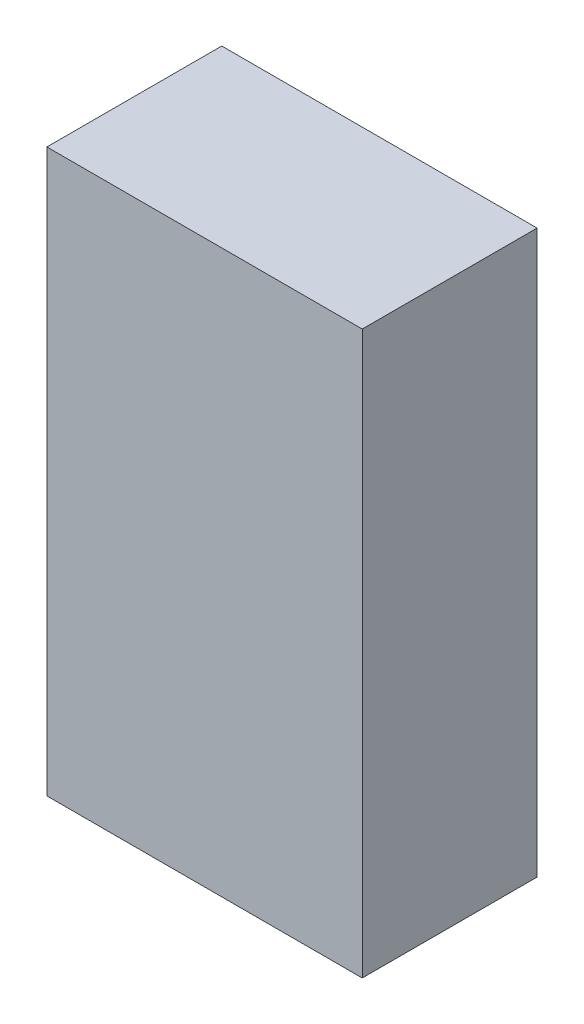
ISO-10303-21;
HEADER;
FILE_DESCRIPTION(('STEP AP214'),'2;1');
FILE_NAME('part.step','',(''),(''),'','','');
FILE_SCHEMA(('AUTOMOTIVE_DESIGN { 1 0 10303 214 1 1 1 1 }'));
ENDSEC;
DATA;
#1=APPLICATION_CONTEXT('core data for automotive mechanical design processes');
#2=APPLICATION_PROTOCOL_DEFINITION('international standard','automotive_design',2000,#1);
#3=PRODUCT_CONTEXT('',#1,'mechanical');
#4=PRODUCT('Part','Part','',(#3));
#5=PRODUCT_RELATED_PRODUCT_CATEGORY('part','',(#4));
#6=PRODUCT_DEFINITION_FORMATION('','',#4);
#7=PRODUCT_DEFINITION_CONTEXT('part definition',#1,'design');
#8=PRODUCT_DEFINITION('design','',#6,#7);
#9=PRODUCT_DEFINITION_SHAPE('','',#8);
#10=(LENGTH_UNIT() NAMED_UNIT(*) SI_UNIT(.MILLI.,.METRE.));
#11=(NAMED_UNIT(*) PLANE_ANGLE_UNIT() SI_UNIT($,.RADIAN.));
#12=(NAMED_UNIT(*) SI_UNIT($,.STERADIAN.) SOLID_ANGLE_UNIT());
#13=UNCERTAINTY_MEASURE_WITH_UNIT(LENGTH_MEASURE(1.E-05),#10,'distance_accuracy_value','');
#14=(GEOMETRIC_REPRESENTATION_CONTEXT(3) GLOBAL_UNCERTAINTY_ASSIGNED_CONTEXT((#13)) GLOBAL_UNIT_ASSIGNED_CONTEXT((#10,
#11,#12)) REPRESENTATION_CONTEXT('',''));
#15=CARTESIAN_POINT('',(0.,0.,0.));
#16=DIRECTION('',(0.,0.,1.));
#17=DIRECTION('',(1.,0.,0.));
#18=AXIS2_PLACEMENT_3D('',#15,#16,#17);
#19=CARTESIAN_POINT('',(-5.05,-9.,5.6));
#20=DIRECTION('',(0.,0.,1.));
#21=DIRECTION('',(1.,0.,0.));
#22=AXIS2_PLACEMENT_3D('',#19,#20,#21);
#23=PLANE('',#22);
#24=DIRECTION('',(0.,1.,0.));
#25=VECTOR('',#24,1.);
#26=CARTESIAN_POINT('',(-5.05,-9.,5.6));
#27=LINE('',#26,#25);
#28=CARTESIAN_POINT('',(-5.05,-9.,5.6));
#29=VERTEX_POINT('',#28);
#30=CARTESIAN_POINT('',(-5.05,9.,5.6));
#31=VERTEX_POINT('',#30);
#32=EDGE_CURVE('E111',#29,#31,#27,.T.);
#33=ORIENTED_EDGE('',*,*,#32,.F.);
#34=DIRECTION('',(1.,0.,0.));
#35=VECTOR('',#34,1.);
#36=CARTESIAN_POINT('',(-5.05,-9.,5.6));
#37=LINE('',#36,#35);
#38=CARTESIAN_POINT('',(5.05,-9.,5.6));
#39=VERTEX_POINT('',#38);
#40=EDGE_CURVE('E75',#29,#39,#37,.T.);
#41=ORIENTED_EDGE('',*,*,#40,.T.);
#42=DIRECTION('',(0.,1.,0.));
#43=VECTOR('',#42,1.);
#44=CARTESIAN_POINT('',(5.05,-9.,5.6));
#45=LINE('',#44,#43);
#46=CARTESIAN_POINT('',(5.05,9.,5.6));
#47=VERTEX_POINT('',#46);
#48=EDGE_CURVE('E87',#39,#47,#45,.T.);
#49=ORIENTED_EDGE('',*,*,#48,.T.);
#50=DIRECTION('',(1.,0.,0.));
#51=VECTOR('',#50,1.);
#52=CARTESIAN_POINT('',(-5.05,9.,5.6));
#53=LINE('',#52,#51);
#54=EDGE_CURVE('E9',#31,#47,#53,.T.);
#55=ORIENTED_EDGE('',*,*,#54,.F.);
#56=EDGE_LOOP('',(#33,#41,#49,#55));
#57=FACE_BOUND('',#56,.T.);
#58=ADVANCED_FACE('F14',(#57),#23,.T.);
#59=CARTESIAN_POINT('',(-5.05,-9.,0.));
#60=DIRECTION('',(0.,0.,1.));
#61=DIRECTION('',(1.,0.,0.));
#62=AXIS2_PLACEMENT_3D('',#59,#60,#61);
#63=PLANE('',#62);
#64=DIRECTION('',(1.,0.,0.));
#65=VECTOR('',#64,1.);
#66=CARTESIAN_POINT('',(-5.05,9.,0.));
#67=LINE('',#66,#65);
#68=CARTESIAN_POINT('',(-5.05,9.,0.));
#69=VERTEX_POINT('',#68);
#70=CARTESIAN_POINT('',(5.05,9.,0.));
#71=VERTEX_POINT('',#70);
#72=EDGE_CURVE('E24',#69,#71,#67,.T.);
#73=ORIENTED_EDGE('',*,*,#72,.T.);
#74=DIRECTION('',(0.,1.,0.));
#75=VECTOR('',#74,1.);
#76=CARTESIAN_POINT('',(5.05,-9.,0.));
#77=LINE('',#76,#75);
#78=CARTESIAN_POINT('',(5.05,-9.,0.));
#79=VERTEX_POINT('',#78);
#80=EDGE_CURVE('E78',#79,#71,#77,.T.);
#81=ORIENTED_EDGE('',*,*,#80,.F.);
#82=DIRECTION('',(1.,0.,0.));
#83=VECTOR('',#82,1.);
#84=CARTESIAN_POINT('',(-5.05,-9.,0.));
#85=LINE('',#84,#83);
#86=CARTESIAN_POINT('',(-5.05,-9.,0.));
#87=VERTEX_POINT('',#86);
#88=EDGE_CURVE('E62',#87,#79,#85,.T.);
#89=ORIENTED_EDGE('',*,*,#88,.F.);
#90=DIRECTION('',(0.,1.,0.));
#91=VECTOR('',#90,1.);
#92=CARTESIAN_POINT('',(-5.05,-9.,0.));
#93=LINE('',#92,#91);
#94=EDGE_CURVE('E93',#87,#69,#93,.T.);
#95=ORIENTED_EDGE('',*,*,#94,.T.);
#96=EDGE_LOOP('',(#73,#81,#89,#95));
#97=FACE_BOUND('',#96,.T.);
#98=ADVANCED_FACE('F79',(#97),#63,.F.);
#99=CARTESIAN_POINT('',(-5.05,9.,0.));
#100=DIRECTION('',(0.,1.,0.));
#101=DIRECTION('',(1.,0.,0.));
#102=AXIS2_PLACEMENT_3D('',#99,#100,#101);
#103=PLANE('',#102);
#104=ORIENTED_EDGE('',*,*,#72,.F.);
#105=DIRECTION('',(0.,0.,1.));
#106=VECTOR('',#105,1.);
#107=CARTESIAN_POINT('',(-5.05,9.,0.));
#108=LINE('',#107,#106);
#109=EDGE_CURVE('E101',#69,#31,#108,.T.);
#110=ORIENTED_EDGE('',*,*,#109,.T.);
#111=ORIENTED_EDGE('',*,*,#54,.T.);
#112=DIRECTION('',(0.,0.,1.));
#113=VECTOR('',#112,1.);
#114=CARTESIAN_POINT('',(5.05,9.,0.));
#115=LINE('',#114,#113);
#116=EDGE_CURVE('E83',#71,#47,#115,.T.);
#117=ORIENTED_EDGE('',*,*,#116,.F.);
#118=EDGE_LOOP('',(#104,#110,#111,#117));
#119=FACE_BOUND('',#118,.T.);
#120=ADVANCED_FACE('F117',(#119),#103,.T.);
#121=CARTESIAN_POINT('',(-5.05,-9.,0.));
#122=DIRECTION('',(0.,1.,0.));
#123=DIRECTION('',(1.,0.,0.));
#124=AXIS2_PLACEMENT_3D('',#121,#122,#123);
#125=PLANE('',#124);
#126=DIRECTION('',(0.,0.,1.));
#127=VECTOR('',#126,1.);
#128=CARTESIAN_POINT('',(5.05,-9.,0.));
#129=LINE('',#128,#127);
#130=EDGE_CURVE('E17',#79,#39,#129,.T.);
#131=ORIENTED_EDGE('',*,*,#130,.T.);
#132=ORIENTED_EDGE('',*,*,#40,.F.);
#133=DIRECTION('',(0.,0.,1.));
#134=VECTOR('',#133,1.);
#135=CARTESIAN_POINT('',(-5.05,-9.,0.));
#136=LINE('',#135,#134);
#137=EDGE_CURVE('E72',#87,#29,#136,.T.);
#138=ORIENTED_EDGE('',*,*,#137,.F.);
#139=ORIENTED_EDGE('',*,*,#88,.T.);
#140=EDGE_LOOP('',(#131,#132,#138,#139));
#141=FACE_BOUND('',#140,.T.);
#142=ADVANCED_FACE('F68',(#141),#125,.F.);
#143=CARTESIAN_POINT('',(5.05,-9.,0.));
#144=DIRECTION('',(1.,0.,0.));
#145=DIRECTION('',(0.,1.,0.));
#146=AXIS2_PLACEMENT_3D('',#143,#144,#145);
#147=PLANE('',#146);
#148=ORIENTED_EDGE('',*,*,#130,.F.);
#149=ORIENTED_EDGE('',*,*,#80,.T.);
#150=ORIENTED_EDGE('',*,*,#116,.T.);
#151=ORIENTED_EDGE('',*,*,#48,.F.);
#152=EDGE_LOOP('',(#148,#149,#150,#151));
#153=FACE_BOUND('',#152,.T.);
#154=ADVANCED_FACE('F86',(#153),#147,.T.);
#155=CARTESIAN_POINT('',(-5.05,-9.,0.));
#156=DIRECTION('',(1.,0.,0.));
#157=DIRECTION('',(0.,1.,0.));
#158=AXIS2_PLACEMENT_3D('',#155,#156,#157);
#159=PLANE('',#158);
#160=ORIENTED_EDGE('',*,*,#32,.T.);
#161=ORIENTED_EDGE('',*,*,#109,.F.);
#162=ORIENTED_EDGE('',*,*,#94,.F.);
#163=ORIENTED_EDGE('',*,*,#137,.T.);
#164=EDGE_LOOP('',(#160,#161,#162,#163));
#165=FACE_BOUND('',#164,.T.);
#166=ADVANCED_FACE('F118',(#165),#159,.F.);
#167=CLOSED_SHELL('',(#58,#98,#120,#142,#154,#166));
#168=MANIFOLD_SOLID_BREP('B1',#167);
#169=ADVANCED_BREP_SHAPE_REPRESENTATION('',(#18,#168),#14);
#170=SHAPE_DEFINITION_REPRESENTATION(#9,#169);
ENDSEC;
END-ISO-10303-21;
